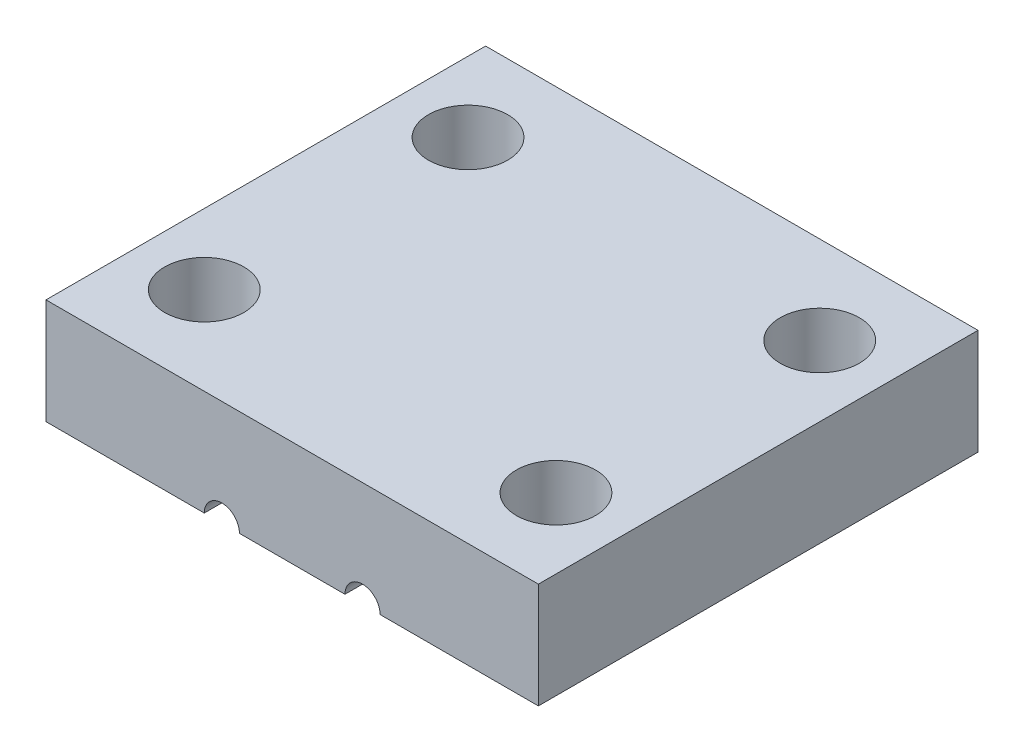
ISO-10303-21;
HEADER;
FILE_DESCRIPTION(('STEP AP214'),'2;1');
FILE_NAME('part.step','',(''),(''),'','','');
FILE_SCHEMA(('AUTOMOTIVE_DESIGN { 1 0 10303 214 1 1 1 1 }'));
ENDSEC;
DATA;
#1=APPLICATION_CONTEXT('core data for automotive mechanical design processes');
#2=APPLICATION_PROTOCOL_DEFINITION('international standard','automotive_design',2000,#1);
#3=PRODUCT_CONTEXT('',#1,'mechanical');
#4=PRODUCT('Part','Part','',(#3));
#5=PRODUCT_RELATED_PRODUCT_CATEGORY('part','',(#4));
#6=PRODUCT_DEFINITION_FORMATION('','',#4);
#7=PRODUCT_DEFINITION_CONTEXT('part definition',#1,'design');
#8=PRODUCT_DEFINITION('design','',#6,#7);
#9=PRODUCT_DEFINITION_SHAPE('','',#8);
#10=(LENGTH_UNIT() NAMED_UNIT(*) SI_UNIT(.MILLI.,.METRE.));
#11=(NAMED_UNIT(*) PLANE_ANGLE_UNIT() SI_UNIT($,.RADIAN.));
#12=(NAMED_UNIT(*) SI_UNIT($,.STERADIAN.) SOLID_ANGLE_UNIT());
#13=UNCERTAINTY_MEASURE_WITH_UNIT(LENGTH_MEASURE(1.E-05),#10,'distance_accuracy_value','');
#14=(GEOMETRIC_REPRESENTATION_CONTEXT(3) GLOBAL_UNCERTAINTY_ASSIGNED_CONTEXT((#13)) GLOBAL_UNIT_ASSIGNED_CONTEXT((#10,
#11,#12)) REPRESENTATION_CONTEXT('',''));
#15=CARTESIAN_POINT('',(0.,0.,0.));
#16=DIRECTION('',(0.,0.,1.));
#17=DIRECTION('',(1.,0.,0.));
#18=AXIS2_PLACEMENT_3D('',#15,#16,#17);
#19=CARTESIAN_POINT('',(-14.,0.,12.5));
#20=DIRECTION('',(0.,1.,0.));
#21=DIRECTION('',(0.,0.,1.));
#22=AXIS2_PLACEMENT_3D('',#19,#20,#21);
#23=PLANE('',#22);
#24=CARTESIAN_POINT('',(-10.,0.,7.5));
#25=DIRECTION('',(0.,1.,0.));
#26=DIRECTION('',(0.,0.,1.));
#27=AXIS2_PLACEMENT_3D('',#24,#25,#26);
#28=CIRCLE('',#27,2.25);
#29=CARTESIAN_POINT('',(-10.,0.,9.75));
#30=VERTEX_POINT('',#29);
#31=EDGE_CURVE('E197',#30,#30,#28,.T.);
#32=ORIENTED_EDGE('',*,*,#31,.T.);
#33=EDGE_LOOP('',(#32));
#34=FACE_BOUND('',#33,.T.);
#35=CARTESIAN_POINT('',(-10.,0.,-7.5));
#36=DIRECTION('',(0.,1.,0.));
#37=DIRECTION('',(0.,0.,1.));
#38=AXIS2_PLACEMENT_3D('',#35,#36,#37);
#39=CIRCLE('',#38,2.25);
#40=CARTESIAN_POINT('',(-10.,0.,-5.25));
#41=VERTEX_POINT('',#40);
#42=EDGE_CURVE('E119',#41,#41,#39,.T.);
#43=ORIENTED_EDGE('',*,*,#42,.T.);
#44=EDGE_LOOP('',(#43));
#45=FACE_BOUND('',#44,.T.);
#46=DIRECTION('',(1.,0.,0.));
#47=VECTOR('',#46,1.);
#48=CARTESIAN_POINT('',(-14.,0.,-12.5));
#49=LINE('',#48,#47);
#50=CARTESIAN_POINT('',(-14.,0.,-12.5));
#51=VERTEX_POINT('',#50);
#52=CARTESIAN_POINT('',(-5.,0.,-12.5));
#53=VERTEX_POINT('',#52);
#54=EDGE_CURVE('E142',#51,#53,#49,.T.);
#55=ORIENTED_EDGE('',*,*,#54,.T.);
#56=DIRECTION('',(0.,0.,1.));
#57=VECTOR('',#56,1.);
#58=CARTESIAN_POINT('',(-5.,0.,-422.5));
#59=LINE('',#58,#57);
#60=CARTESIAN_POINT('',(-5.,0.,12.5));
#61=VERTEX_POINT('',#60);
#62=EDGE_CURVE('E61',#53,#61,#59,.T.);
#63=ORIENTED_EDGE('',*,*,#62,.T.);
#64=DIRECTION('',(1.,0.,0.));
#65=VECTOR('',#64,1.);
#66=CARTESIAN_POINT('',(-14.,0.,12.5));
#67=LINE('',#66,#65);
#68=CARTESIAN_POINT('',(-14.,0.,12.5));
#69=VERTEX_POINT('',#68);
#70=EDGE_CURVE('E127',#69,#61,#67,.T.);
#71=ORIENTED_EDGE('',*,*,#70,.F.);
#72=DIRECTION('',(0.,0.,-1.));
#73=VECTOR('',#72,1.);
#74=CARTESIAN_POINT('',(-14.,0.,12.5));
#75=LINE('',#74,#73);
#76=EDGE_CURVE('E155',#69,#51,#75,.T.);
#77=ORIENTED_EDGE('',*,*,#76,.T.);
#78=EDGE_LOOP('',(#55,#63,#71,#77));
#79=FACE_BOUND('',#78,.T.);
#80=ADVANCED_FACE('F39',(#34,#45,#79),#23,.F.);
#81=CARTESIAN_POINT('',(-3.,0.,12.5));
#82=VERTEX_POINT('',#81);
#83=CARTESIAN_POINT('',(3.,0.,12.5));
#84=VERTEX_POINT('',#83);
#85=EDGE_CURVE('E118',#82,#84,#67,.T.);
#86=ORIENTED_EDGE('',*,*,#85,.F.);
#87=DIRECTION('',(0.,0.,1.));
#88=VECTOR('',#87,1.);
#89=CARTESIAN_POINT('',(-3.,0.,-422.5));
#90=LINE('',#89,#88);
#91=CARTESIAN_POINT('',(-3.,0.,-12.5));
#92=VERTEX_POINT('',#91);
#93=EDGE_CURVE('E171',#82,#92,#90,.F.);
#94=ORIENTED_EDGE('',*,*,#93,.T.);
#95=CARTESIAN_POINT('',(3.,0.,-12.5));
#96=VERTEX_POINT('',#95);
#97=EDGE_CURVE('E146',#92,#96,#49,.T.);
#98=ORIENTED_EDGE('',*,*,#97,.T.);
#99=DIRECTION('',(0.,0.,1.));
#100=VECTOR('',#99,1.);
#101=CARTESIAN_POINT('',(3.,0.,-422.5));
#102=LINE('',#101,#100);
#103=EDGE_CURVE('E54',#96,#84,#102,.T.);
#104=ORIENTED_EDGE('',*,*,#103,.T.);
#105=EDGE_LOOP('',(#86,#94,#98,#104));
#106=FACE_BOUND('',#105,.T.);
#107=ADVANCED_FACE('F173',(#106),#23,.F.);
#108=CARTESIAN_POINT('',(-14.,0.,12.5));
#109=DIRECTION('',(1.,0.,0.));
#110=DIRECTION('',(0.,1.,0.));
#111=AXIS2_PLACEMENT_3D('',#108,#109,#110);
#112=PLANE('',#111);
#113=DIRECTION('',(0.,-1.,0.));
#114=VECTOR('',#113,1.);
#115=CARTESIAN_POINT('',(-14.,0.,-12.5));
#116=LINE('',#115,#114);
#117=CARTESIAN_POINT('',(-14.,6.,-12.5));
#118=VERTEX_POINT('',#117);
#119=EDGE_CURVE('E138',#118,#51,#116,.T.);
#120=ORIENTED_EDGE('',*,*,#119,.T.);
#121=ORIENTED_EDGE('',*,*,#76,.F.);
#122=DIRECTION('',(0.,-1.,0.));
#123=VECTOR('',#122,1.);
#124=CARTESIAN_POINT('',(-14.,0.,12.5));
#125=LINE('',#124,#123);
#126=CARTESIAN_POINT('',(-14.,6.,12.5));
#127=VERTEX_POINT('',#126);
#128=EDGE_CURVE('E125',#127,#69,#125,.T.);
#129=ORIENTED_EDGE('',*,*,#128,.F.);
#130=DIRECTION('',(0.,0.,-1.));
#131=VECTOR('',#130,1.);
#132=CARTESIAN_POINT('',(-14.,6.,12.5));
#133=LINE('',#132,#131);
#134=EDGE_CURVE('E135',#127,#118,#133,.T.);
#135=ORIENTED_EDGE('',*,*,#134,.T.);
#136=EDGE_LOOP('',(#120,#121,#129,#135));
#137=FACE_BOUND('',#136,.T.);
#138=ADVANCED_FACE('F41',(#137),#112,.F.);
#139=CARTESIAN_POINT('',(10.,0.,-7.5));
#140=DIRECTION('',(0.,1.,0.));
#141=DIRECTION('',(0.,0.,1.));
#142=AXIS2_PLACEMENT_3D('',#139,#140,#141);
#143=CIRCLE('',#142,2.25);
#144=CARTESIAN_POINT('',(10.,0.,-5.25));
#145=VERTEX_POINT('',#144);
#146=EDGE_CURVE('E185',#145,#145,#143,.T.);
#147=ORIENTED_EDGE('',*,*,#146,.T.);
#148=EDGE_LOOP('',(#147));
#149=FACE_BOUND('',#148,.T.);
#150=CARTESIAN_POINT('',(10.,0.,7.5));
#151=DIRECTION('',(0.,1.,0.));
#152=DIRECTION('',(0.,0.,1.));
#153=AXIS2_PLACEMENT_3D('',#150,#151,#152);
#154=CIRCLE('',#153,2.25);
#155=CARTESIAN_POINT('',(10.,0.,9.75));
#156=VERTEX_POINT('',#155);
#157=EDGE_CURVE('E191',#156,#156,#154,.T.);
#158=ORIENTED_EDGE('',*,*,#157,.T.);
#159=EDGE_LOOP('',(#158));
#160=FACE_BOUND('',#159,.T.);
#161=CARTESIAN_POINT('',(5.,0.,12.5));
#162=VERTEX_POINT('',#161);
#163=CARTESIAN_POINT('',(14.,0.,12.5));
#164=VERTEX_POINT('',#163);
#165=EDGE_CURVE('E114',#162,#164,#67,.T.);
#166=ORIENTED_EDGE('',*,*,#165,.F.);
#167=DIRECTION('',(0.,0.,1.));
#168=VECTOR('',#167,1.);
#169=CARTESIAN_POINT('',(5.,0.,-422.5));
#170=LINE('',#169,#168);
#171=CARTESIAN_POINT('',(5.,0.,-12.5));
#172=VERTEX_POINT('',#171);
#173=EDGE_CURVE('E101',#162,#172,#170,.F.);
#174=ORIENTED_EDGE('',*,*,#173,.T.);
#175=CARTESIAN_POINT('',(14.,0.,-12.5));
#176=VERTEX_POINT('',#175);
#177=EDGE_CURVE('E141',#172,#176,#49,.T.);
#178=ORIENTED_EDGE('',*,*,#177,.T.);
#179=DIRECTION('',(0.,0.,-1.));
#180=VECTOR('',#179,1.);
#181=CARTESIAN_POINT('',(14.,0.,12.5));
#182=LINE('',#181,#180);
#183=EDGE_CURVE('E123',#164,#176,#182,.T.);
#184=ORIENTED_EDGE('',*,*,#183,.F.);
#185=EDGE_LOOP('',(#166,#174,#178,#184));
#186=FACE_BOUND('',#185,.T.);
#187=ADVANCED_FACE('F121',(#149,#160,#186),#23,.F.);
#188=CARTESIAN_POINT('',(14.,6.,12.5));
#189=DIRECTION('',(-1.,0.,0.));
#190=DIRECTION('',(0.,-1.,0.));
#191=AXIS2_PLACEMENT_3D('',#188,#189,#190);
#192=PLANE('',#191);
#193=DIRECTION('',(0.,1.,0.));
#194=VECTOR('',#193,1.);
#195=CARTESIAN_POINT('',(14.,6.,-12.5));
#196=LINE('',#195,#194);
#197=CARTESIAN_POINT('',(14.,6.,-12.5));
#198=VERTEX_POINT('',#197);
#199=EDGE_CURVE('E145',#176,#198,#196,.T.);
#200=ORIENTED_EDGE('',*,*,#199,.T.);
#201=DIRECTION('',(0.,0.,-1.));
#202=VECTOR('',#201,1.);
#203=CARTESIAN_POINT('',(14.,6.,12.5));
#204=LINE('',#203,#202);
#205=CARTESIAN_POINT('',(14.,6.,12.5));
#206=VERTEX_POINT('',#205);
#207=EDGE_CURVE('E151',#206,#198,#204,.T.);
#208=ORIENTED_EDGE('',*,*,#207,.F.);
#209=DIRECTION('',(0.,1.,0.));
#210=VECTOR('',#209,1.);
#211=CARTESIAN_POINT('',(14.,6.,12.5));
#212=LINE('',#211,#210);
#213=EDGE_CURVE('E132',#164,#206,#212,.T.);
#214=ORIENTED_EDGE('',*,*,#213,.F.);
#215=ORIENTED_EDGE('',*,*,#183,.T.);
#216=EDGE_LOOP('',(#200,#208,#214,#215));
#217=FACE_BOUND('',#216,.T.);
#218=ADVANCED_FACE('F208',(#217),#192,.F.);
#219=CARTESIAN_POINT('',(-14.,6.,12.5));
#220=DIRECTION('',(0.,-1.,0.));
#221=DIRECTION('',(0.,0.,-1.));
#222=AXIS2_PLACEMENT_3D('',#219,#220,#221);
#223=PLANE('',#222);
#224=CARTESIAN_POINT('',(10.,6.,-7.5));
#225=DIRECTION('',(0.,1.,0.));
#226=DIRECTION('',(0.,0.,1.));
#227=AXIS2_PLACEMENT_3D('',#224,#225,#226);
#228=CIRCLE('',#227,2.25);
#229=CARTESIAN_POINT('',(10.,6.,-5.25));
#230=VERTEX_POINT('',#229);
#231=EDGE_CURVE('E188',#230,#230,#228,.T.);
#232=ORIENTED_EDGE('',*,*,#231,.F.);
#233=EDGE_LOOP('',(#232));
#234=FACE_BOUND('',#233,.T.);
#235=CARTESIAN_POINT('',(10.,6.,7.5));
#236=DIRECTION('',(0.,1.,0.));
#237=DIRECTION('',(0.,0.,1.));
#238=AXIS2_PLACEMENT_3D('',#235,#236,#237);
#239=CIRCLE('',#238,2.25);
#240=CARTESIAN_POINT('',(10.,6.,9.75));
#241=VERTEX_POINT('',#240);
#242=EDGE_CURVE('E194',#241,#241,#239,.T.);
#243=ORIENTED_EDGE('',*,*,#242,.F.);
#244=EDGE_LOOP('',(#243));
#245=FACE_BOUND('',#244,.T.);
#246=CARTESIAN_POINT('',(-10.,6.,7.5));
#247=DIRECTION('',(0.,1.,0.));
#248=DIRECTION('',(0.,0.,1.));
#249=AXIS2_PLACEMENT_3D('',#246,#247,#248);
#250=CIRCLE('',#249,2.25);
#251=CARTESIAN_POINT('',(-10.,6.,9.75));
#252=VERTEX_POINT('',#251);
#253=EDGE_CURVE('E182',#252,#252,#250,.T.);
#254=ORIENTED_EDGE('',*,*,#253,.F.);
#255=EDGE_LOOP('',(#254));
#256=FACE_BOUND('',#255,.T.);
#257=CARTESIAN_POINT('',(-10.,6.,-7.5));
#258=DIRECTION('',(0.,1.,0.));
#259=DIRECTION('',(0.,0.,1.));
#260=AXIS2_PLACEMENT_3D('',#257,#258,#259);
#261=CIRCLE('',#260,2.25);
#262=CARTESIAN_POINT('',(-10.,6.,-5.25));
#263=VERTEX_POINT('',#262);
#264=EDGE_CURVE('E179',#263,#263,#261,.T.);
#265=ORIENTED_EDGE('',*,*,#264,.F.);
#266=EDGE_LOOP('',(#265));
#267=FACE_BOUND('',#266,.T.);
#268=DIRECTION('',(-1.,0.,0.));
#269=VECTOR('',#268,1.);
#270=CARTESIAN_POINT('',(-14.,6.,-12.5));
#271=LINE('',#270,#269);
#272=EDGE_CURVE('E129',#198,#118,#271,.T.);
#273=ORIENTED_EDGE('',*,*,#272,.T.);
#274=ORIENTED_EDGE('',*,*,#134,.F.);
#275=DIRECTION('',(-1.,0.,0.));
#276=VECTOR('',#275,1.);
#277=CARTESIAN_POINT('',(-14.,6.,12.5));
#278=LINE('',#277,#276);
#279=EDGE_CURVE('E133',#206,#127,#278,.T.);
#280=ORIENTED_EDGE('',*,*,#279,.F.);
#281=ORIENTED_EDGE('',*,*,#207,.T.);
#282=EDGE_LOOP('',(#273,#274,#280,#281));
#283=FACE_BOUND('',#282,.T.);
#284=ADVANCED_FACE('F205',(#234,#245,#256,#267,#283),#223,.F.);
#285=CARTESIAN_POINT('',(0.,0.,12.5));
#286=DIRECTION('',(0.,0.,-1.));
#287=DIRECTION('',(-1.,0.,0.));
#288=AXIS2_PLACEMENT_3D('',#285,#286,#287);
#289=PLANE('',#288);
#290=ORIENTED_EDGE('',*,*,#70,.T.);
#291=CARTESIAN_POINT('',(-4.,0.,12.5));
#292=DIRECTION('',(0.,0.,1.));
#293=DIRECTION('',(1.,0.,0.));
#294=AXIS2_PLACEMENT_3D('',#291,#292,#293);
#295=CIRCLE('',#294,1.);
#296=EDGE_CURVE('E108',#82,#61,#295,.T.);
#297=ORIENTED_EDGE('',*,*,#296,.F.);
#298=ORIENTED_EDGE('',*,*,#85,.T.);
#299=CARTESIAN_POINT('',(4.,0.,12.5));
#300=DIRECTION('',(0.,0.,1.));
#301=DIRECTION('',(1.,0.,0.));
#302=AXIS2_PLACEMENT_3D('',#299,#300,#301);
#303=CIRCLE('',#302,1.);
#304=EDGE_CURVE('E104',#162,#84,#303,.T.);
#305=ORIENTED_EDGE('',*,*,#304,.F.);
#306=ORIENTED_EDGE('',*,*,#165,.T.);
#307=ORIENTED_EDGE('',*,*,#213,.T.);
#308=ORIENTED_EDGE('',*,*,#279,.T.);
#309=ORIENTED_EDGE('',*,*,#128,.T.);
#310=EDGE_LOOP('',(#290,#297,#298,#305,#306,#307,#308,#309));
#311=FACE_BOUND('',#310,.T.);
#312=ADVANCED_FACE('F113',(#311),#289,.F.);
#313=CARTESIAN_POINT('',(0.,0.,-12.5));
#314=DIRECTION('',(0.,0.,-1.));
#315=DIRECTION('',(-1.,0.,0.));
#316=AXIS2_PLACEMENT_3D('',#313,#314,#315);
#317=PLANE('',#316);
#318=CARTESIAN_POINT('',(-4.,0.,-12.5));
#319=DIRECTION('',(0.,0.,-1.));
#320=DIRECTION('',(-1.,0.,0.));
#321=AXIS2_PLACEMENT_3D('',#318,#319,#320);
#322=CIRCLE('',#321,1.);
#323=EDGE_CURVE('E11',#53,#92,#322,.T.);
#324=ORIENTED_EDGE('',*,*,#323,.F.);
#325=ORIENTED_EDGE('',*,*,#54,.F.);
#326=ORIENTED_EDGE('',*,*,#119,.F.);
#327=ORIENTED_EDGE('',*,*,#272,.F.);
#328=ORIENTED_EDGE('',*,*,#199,.F.);
#329=ORIENTED_EDGE('',*,*,#177,.F.);
#330=CARTESIAN_POINT('',(4.,0.,-12.5));
#331=DIRECTION('',(0.,0.,-1.));
#332=DIRECTION('',(-1.,0.,0.));
#333=AXIS2_PLACEMENT_3D('',#330,#331,#332);
#334=CIRCLE('',#333,1.);
#335=EDGE_CURVE('E47',#96,#172,#334,.T.);
#336=ORIENTED_EDGE('',*,*,#335,.F.);
#337=ORIENTED_EDGE('',*,*,#97,.F.);
#338=EDGE_LOOP('',(#324,#325,#326,#327,#328,#329,#336,#337));
#339=FACE_BOUND('',#338,.T.);
#340=ADVANCED_FACE('F165',(#339),#317,.T.);
#341=CARTESIAN_POINT('',(4.,0.,-422.5));
#342=DIRECTION('',(0.,0.,1.));
#343=DIRECTION('',(1.,0.,0.));
#344=AXIS2_PLACEMENT_3D('',#341,#342,#343);
#345=CYLINDRICAL_SURFACE('',#344,1.);
#346=ORIENTED_EDGE('',*,*,#335,.T.);
#347=ORIENTED_EDGE('',*,*,#173,.F.);
#348=ORIENTED_EDGE('',*,*,#304,.T.);
#349=ORIENTED_EDGE('',*,*,#103,.F.);
#350=EDGE_LOOP('',(#346,#347,#348,#349));
#351=FACE_BOUND('',#350,.T.);
#352=ADVANCED_FACE('F103',(#351),#345,.F.);
#353=CARTESIAN_POINT('',(-4.,0.,-422.5));
#354=DIRECTION('',(0.,0.,1.));
#355=DIRECTION('',(1.,0.,0.));
#356=AXIS2_PLACEMENT_3D('',#353,#354,#355);
#357=CYLINDRICAL_SURFACE('',#356,1.);
#358=ORIENTED_EDGE('',*,*,#323,.T.);
#359=ORIENTED_EDGE('',*,*,#93,.F.);
#360=ORIENTED_EDGE('',*,*,#296,.T.);
#361=ORIENTED_EDGE('',*,*,#62,.F.);
#362=EDGE_LOOP('',(#358,#359,#360,#361));
#363=FACE_BOUND('',#362,.T.);
#364=ADVANCED_FACE('F170',(#363),#357,.F.);
#365=CARTESIAN_POINT('',(-10.,0.,-7.5));
#366=DIRECTION('',(0.,1.,0.));
#367=DIRECTION('',(0.,0.,1.));
#368=AXIS2_PLACEMENT_3D('',#365,#366,#367);
#369=CYLINDRICAL_SURFACE('',#368,2.25);
#370=ORIENTED_EDGE('',*,*,#42,.F.);
#371=EDGE_LOOP('',(#370));
#372=FACE_BOUND('',#371,.T.);
#373=ORIENTED_EDGE('',*,*,#264,.T.);
#374=EDGE_LOOP('',(#373));
#375=FACE_BOUND('',#374,.T.);
#376=ADVANCED_FACE('F232',(#372,#375),#369,.F.);
#377=CARTESIAN_POINT('',(-10.,0.,7.5));
#378=DIRECTION('',(0.,1.,0.));
#379=DIRECTION('',(0.,0.,1.));
#380=AXIS2_PLACEMENT_3D('',#377,#378,#379);
#381=CYLINDRICAL_SURFACE('',#380,2.25);
#382=ORIENTED_EDGE('',*,*,#31,.F.);
#383=EDGE_LOOP('',(#382));
#384=FACE_BOUND('',#383,.T.);
#385=ORIENTED_EDGE('',*,*,#253,.T.);
#386=EDGE_LOOP('',(#385));
#387=FACE_BOUND('',#386,.T.);
#388=ADVANCED_FACE('F203',(#384,#387),#381,.F.);
#389=CARTESIAN_POINT('',(10.,0.,7.5));
#390=DIRECTION('',(0.,1.,0.));
#391=DIRECTION('',(0.,0.,1.));
#392=AXIS2_PLACEMENT_3D('',#389,#390,#391);
#393=CYLINDRICAL_SURFACE('',#392,2.25);
#394=ORIENTED_EDGE('',*,*,#157,.F.);
#395=EDGE_LOOP('',(#394));
#396=FACE_BOUND('',#395,.T.);
#397=ORIENTED_EDGE('',*,*,#242,.T.);
#398=EDGE_LOOP('',(#397));
#399=FACE_BOUND('',#398,.T.);
#400=ADVANCED_FACE('F239',(#396,#399),#393,.F.);
#401=CARTESIAN_POINT('',(10.,0.,-7.5));
#402=DIRECTION('',(0.,1.,0.));
#403=DIRECTION('',(0.,0.,1.));
#404=AXIS2_PLACEMENT_3D('',#401,#402,#403);
#405=CYLINDRICAL_SURFACE('',#404,2.25);
#406=ORIENTED_EDGE('',*,*,#146,.F.);
#407=EDGE_LOOP('',(#406));
#408=FACE_BOUND('',#407,.T.);
#409=ORIENTED_EDGE('',*,*,#231,.T.);
#410=EDGE_LOOP('',(#409));
#411=FACE_BOUND('',#410,.T.);
#412=ADVANCED_FACE('F244',(#408,#411),#405,.F.);
#413=CLOSED_SHELL('',(#80,#107,#138,#187,#218,#284,#312,#340,#352,#364,#376,#388,#400,#412));
#414=MANIFOLD_SOLID_BREP('B2',#413);
#415=ADVANCED_BREP_SHAPE_REPRESENTATION('',(#18,#414),#14);
#416=SHAPE_DEFINITION_REPRESENTATION(#9,#415);
ENDSEC;
END-ISO-10303-21;
